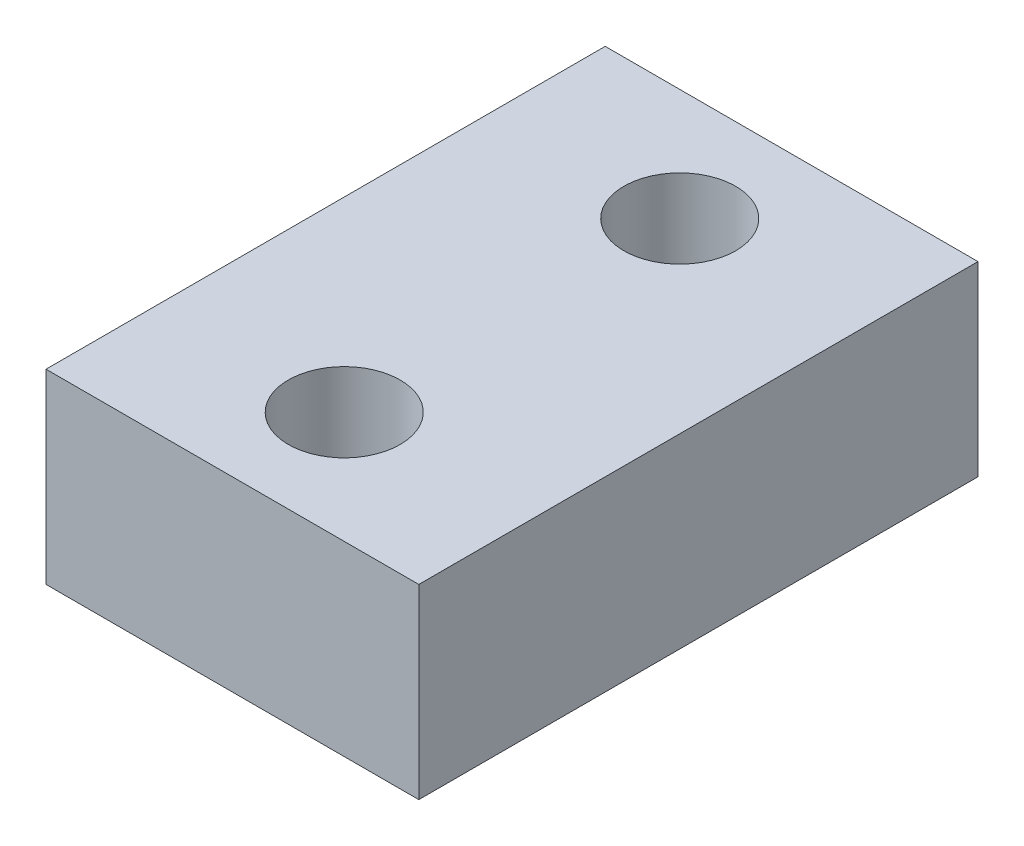
ISO-10303-21;
HEADER;
FILE_DESCRIPTION(('STEP AP214'),'2;1');
FILE_NAME('part.step','',(''),(''),'','','');
FILE_SCHEMA(('AUTOMOTIVE_DESIGN { 1 0 10303 214 1 1 1 1 }'));
ENDSEC;
DATA;
#1=APPLICATION_CONTEXT('core data for automotive mechanical design processes');
#2=APPLICATION_PROTOCOL_DEFINITION('international standard','automotive_design',2000,#1);
#3=PRODUCT_CONTEXT('',#1,'mechanical');
#4=PRODUCT('Part','Part','',(#3));
#5=PRODUCT_RELATED_PRODUCT_CATEGORY('part','',(#4));
#6=PRODUCT_DEFINITION_FORMATION('','',#4);
#7=PRODUCT_DEFINITION_CONTEXT('part definition',#1,'design');
#8=PRODUCT_DEFINITION('design','',#6,#7);
#9=PRODUCT_DEFINITION_SHAPE('','',#8);
#10=(LENGTH_UNIT() NAMED_UNIT(*) SI_UNIT(.MILLI.,.METRE.));
#11=(NAMED_UNIT(*) PLANE_ANGLE_UNIT() SI_UNIT($,.RADIAN.));
#12=(NAMED_UNIT(*) SI_UNIT($,.STERADIAN.) SOLID_ANGLE_UNIT());
#13=UNCERTAINTY_MEASURE_WITH_UNIT(LENGTH_MEASURE(1.E-05),#10,'distance_accuracy_value','');
#14=(GEOMETRIC_REPRESENTATION_CONTEXT(3) GLOBAL_UNCERTAINTY_ASSIGNED_CONTEXT((#13)) GLOBAL_UNIT_ASSIGNED_CONTEXT((#10,
#11,#12)) REPRESENTATION_CONTEXT('',''));
#15=CARTESIAN_POINT('',(0.,0.,0.));
#16=DIRECTION('',(0.,0.,1.));
#17=DIRECTION('',(1.,0.,0.));
#18=AXIS2_PLACEMENT_3D('',#15,#16,#17);
#19=CARTESIAN_POINT('',(0.,5.,15.));
#20=DIRECTION('',(-1.,0.,0.));
#21=DIRECTION('',(0.,-1.,0.));
#22=AXIS2_PLACEMENT_3D('',#19,#20,#21);
#23=PLANE('',#22);
#24=DIRECTION('',(0.,1.,0.));
#25=VECTOR('',#24,1.);
#26=CARTESIAN_POINT('',(0.,5.,0.));
#27=LINE('',#26,#25);
#28=CARTESIAN_POINT('',(0.,0.,0.));
#29=VERTEX_POINT('',#28);
#30=CARTESIAN_POINT('',(0.,5.,0.));
#31=VERTEX_POINT('',#30);
#32=EDGE_CURVE('E96',#29,#31,#27,.T.);
#33=ORIENTED_EDGE('',*,*,#32,.T.);
#34=DIRECTION('',(0.,0.,-1.));
#35=VECTOR('',#34,1.);
#36=CARTESIAN_POINT('',(0.,5.,15.));
#37=LINE('',#36,#35);
#38=CARTESIAN_POINT('',(0.,5.,15.));
#39=VERTEX_POINT('',#38);
#40=EDGE_CURVE('E11',#39,#31,#37,.T.);
#41=ORIENTED_EDGE('',*,*,#40,.F.);
#42=DIRECTION('',(0.,1.,0.));
#43=VECTOR('',#42,1.);
#44=CARTESIAN_POINT('',(0.,5.,15.));
#45=LINE('',#44,#43);
#46=CARTESIAN_POINT('',(0.,0.,15.));
#47=VERTEX_POINT('',#46);
#48=EDGE_CURVE('E84',#47,#39,#45,.T.);
#49=ORIENTED_EDGE('',*,*,#48,.F.);
#50=DIRECTION('',(0.,0.,-1.));
#51=VECTOR('',#50,1.);
#52=CARTESIAN_POINT('',(0.,0.,15.));
#53=LINE('',#52,#51);
#54=EDGE_CURVE('E92',#47,#29,#53,.T.);
#55=ORIENTED_EDGE('',*,*,#54,.T.);
#56=EDGE_LOOP('',(#33,#41,#49,#55));
#57=FACE_BOUND('',#56,.T.);
#58=ADVANCED_FACE('F33',(#57),#23,.F.);
#59=CARTESIAN_POINT('',(-10.,5.,15.));
#60=DIRECTION('',(0.,-1.,0.));
#61=DIRECTION('',(0.,0.,-1.));
#62=AXIS2_PLACEMENT_3D('',#59,#60,#61);
#63=PLANE('',#62);
#64=CARTESIAN_POINT('',(-5.,5.,3.));
#65=DIRECTION('',(0.,-1.,0.));
#66=DIRECTION('',(1.,0.,0.));
#67=AXIS2_PLACEMENT_3D('',#64,#65,#66);
#68=CIRCLE('',#67,1.5);
#69=CARTESIAN_POINT('',(-3.5,5.,3.));
#70=VERTEX_POINT('',#69);
#71=EDGE_CURVE('E113',#70,#70,#68,.T.);
#72=ORIENTED_EDGE('',*,*,#71,.T.);
#73=EDGE_LOOP('',(#72));
#74=FACE_BOUND('',#73,.T.);
#75=CARTESIAN_POINT('',(-5.,5.,12.));
#76=DIRECTION('',(0.,-1.,0.));
#77=DIRECTION('',(1.,0.,0.));
#78=AXIS2_PLACEMENT_3D('',#75,#76,#77);
#79=CIRCLE('',#78,1.5);
#80=CARTESIAN_POINT('',(-3.5,5.,12.));
#81=VERTEX_POINT('',#80);
#82=EDGE_CURVE('E99',#81,#81,#79,.T.);
#83=ORIENTED_EDGE('',*,*,#82,.T.);
#84=EDGE_LOOP('',(#83));
#85=FACE_BOUND('',#84,.T.);
#86=DIRECTION('',(-1.,0.,0.));
#87=VECTOR('',#86,1.);
#88=CARTESIAN_POINT('',(-10.,5.,0.));
#89=LINE('',#88,#87);
#90=CARTESIAN_POINT('',(-10.,5.,0.));
#91=VERTEX_POINT('',#90);
#92=EDGE_CURVE('E88',#31,#91,#89,.T.);
#93=ORIENTED_EDGE('',*,*,#92,.T.);
#94=DIRECTION('',(0.,0.,-1.));
#95=VECTOR('',#94,1.);
#96=CARTESIAN_POINT('',(-10.,5.,15.));
#97=LINE('',#96,#95);
#98=CARTESIAN_POINT('',(-10.,5.,15.));
#99=VERTEX_POINT('',#98);
#100=EDGE_CURVE('E41',#99,#91,#97,.T.);
#101=ORIENTED_EDGE('',*,*,#100,.F.);
#102=DIRECTION('',(-1.,0.,0.));
#103=VECTOR('',#102,1.);
#104=CARTESIAN_POINT('',(-10.,5.,15.));
#105=LINE('',#104,#103);
#106=EDGE_CURVE('E79',#39,#99,#105,.T.);
#107=ORIENTED_EDGE('',*,*,#106,.F.);
#108=ORIENTED_EDGE('',*,*,#40,.T.);
#109=EDGE_LOOP('',(#93,#101,#107,#108));
#110=FACE_BOUND('',#109,.T.);
#111=ADVANCED_FACE('F87',(#74,#85,#110),#63,.F.);
#112=CARTESIAN_POINT('',(-10.,0.,15.));
#113=DIRECTION('',(1.,0.,0.));
#114=DIRECTION('',(0.,0.,-1.));
#115=AXIS2_PLACEMENT_3D('',#112,#113,#114);
#116=PLANE('',#115);
#117=DIRECTION('',(0.,-1.,0.));
#118=VECTOR('',#117,1.);
#119=CARTESIAN_POINT('',(-10.,0.,0.));
#120=LINE('',#119,#118);
#121=CARTESIAN_POINT('',(-10.,0.,0.));
#122=VERTEX_POINT('',#121);
#123=EDGE_CURVE('E66',#91,#122,#120,.T.);
#124=ORIENTED_EDGE('',*,*,#123,.T.);
#125=DIRECTION('',(0.,0.,-1.));
#126=VECTOR('',#125,1.);
#127=CARTESIAN_POINT('',(-10.,0.,15.));
#128=LINE('',#127,#126);
#129=CARTESIAN_POINT('',(-10.,0.,15.));
#130=VERTEX_POINT('',#129);
#131=EDGE_CURVE('E89',#130,#122,#128,.T.);
#132=ORIENTED_EDGE('',*,*,#131,.F.);
#133=DIRECTION('',(0.,-1.,0.));
#134=VECTOR('',#133,1.);
#135=CARTESIAN_POINT('',(-10.,0.,15.));
#136=LINE('',#135,#134);
#137=EDGE_CURVE('E82',#99,#130,#136,.T.);
#138=ORIENTED_EDGE('',*,*,#137,.F.);
#139=ORIENTED_EDGE('',*,*,#100,.T.);
#140=EDGE_LOOP('',(#124,#132,#138,#139));
#141=FACE_BOUND('',#140,.T.);
#142=ADVANCED_FACE('F90',(#141),#116,.F.);
#143=CARTESIAN_POINT('',(0.,0.,15.));
#144=DIRECTION('',(0.,1.,0.));
#145=DIRECTION('',(-1.,0.,0.));
#146=AXIS2_PLACEMENT_3D('',#143,#144,#145);
#147=PLANE('',#146);
#148=CARTESIAN_POINT('',(-5.,0.,3.));
#149=DIRECTION('',(0.,-1.,0.));
#150=DIRECTION('',(1.,0.,0.));
#151=AXIS2_PLACEMENT_3D('',#148,#149,#150);
#152=CIRCLE('',#151,1.5);
#153=CARTESIAN_POINT('',(-3.5,0.,3.));
#154=VERTEX_POINT('',#153);
#155=EDGE_CURVE('E116',#154,#154,#152,.T.);
#156=ORIENTED_EDGE('',*,*,#155,.F.);
#157=EDGE_LOOP('',(#156));
#158=FACE_BOUND('',#157,.T.);
#159=CARTESIAN_POINT('',(-5.,0.,12.));
#160=DIRECTION('',(0.,-1.,0.));
#161=DIRECTION('',(1.,0.,0.));
#162=AXIS2_PLACEMENT_3D('',#159,#160,#161);
#163=CIRCLE('',#162,1.5);
#164=CARTESIAN_POINT('',(-3.5,0.,12.));
#165=VERTEX_POINT('',#164);
#166=EDGE_CURVE('E110',#165,#165,#163,.T.);
#167=ORIENTED_EDGE('',*,*,#166,.F.);
#168=EDGE_LOOP('',(#167));
#169=FACE_BOUND('',#168,.T.);
#170=DIRECTION('',(1.,0.,0.));
#171=VECTOR('',#170,1.);
#172=CARTESIAN_POINT('',(0.,0.,0.));
#173=LINE('',#172,#171);
#174=EDGE_CURVE('E72',#122,#29,#173,.T.);
#175=ORIENTED_EDGE('',*,*,#174,.T.);
#176=ORIENTED_EDGE('',*,*,#54,.F.);
#177=DIRECTION('',(1.,0.,0.));
#178=VECTOR('',#177,1.);
#179=CARTESIAN_POINT('',(0.,0.,15.));
#180=LINE('',#179,#178);
#181=EDGE_CURVE('E49',#130,#47,#180,.T.);
#182=ORIENTED_EDGE('',*,*,#181,.F.);
#183=ORIENTED_EDGE('',*,*,#131,.T.);
#184=EDGE_LOOP('',(#175,#176,#182,#183));
#185=FACE_BOUND('',#184,.T.);
#186=ADVANCED_FACE('F104',(#158,#169,#185),#147,.F.);
#187=CARTESIAN_POINT('',(0.,0.,15.));
#188=DIRECTION('',(0.,0.,-1.));
#189=DIRECTION('',(-1.,0.,0.));
#190=AXIS2_PLACEMENT_3D('',#187,#188,#189);
#191=PLANE('',#190);
#192=ORIENTED_EDGE('',*,*,#48,.T.);
#193=ORIENTED_EDGE('',*,*,#106,.T.);
#194=ORIENTED_EDGE('',*,*,#137,.T.);
#195=ORIENTED_EDGE('',*,*,#181,.T.);
#196=EDGE_LOOP('',(#192,#193,#194,#195));
#197=FACE_BOUND('',#196,.T.);
#198=ADVANCED_FACE('F80',(#197),#191,.F.);
#199=CARTESIAN_POINT('',(0.,0.,0.));
#200=DIRECTION('',(0.,0.,-1.));
#201=DIRECTION('',(-1.,0.,0.));
#202=AXIS2_PLACEMENT_3D('',#199,#200,#201);
#203=PLANE('',#202);
#204=ORIENTED_EDGE('',*,*,#32,.F.);
#205=ORIENTED_EDGE('',*,*,#174,.F.);
#206=ORIENTED_EDGE('',*,*,#123,.F.);
#207=ORIENTED_EDGE('',*,*,#92,.F.);
#208=EDGE_LOOP('',(#204,#205,#206,#207));
#209=FACE_BOUND('',#208,.T.);
#210=ADVANCED_FACE('F107',(#209),#203,.T.);
#211=CARTESIAN_POINT('',(-5.,5.,12.));
#212=DIRECTION('',(0.,-1.,0.));
#213=DIRECTION('',(1.,0.,0.));
#214=AXIS2_PLACEMENT_3D('',#211,#212,#213);
#215=CYLINDRICAL_SURFACE('',#214,1.5);
#216=CARTESIAN_POINT('',(-3.5,5.,12.));
#217=CARTESIAN_POINT('',(-3.5,4.94791666666667,12.));
#218=CARTESIAN_POINT('',(-3.5,4.89583333333334,12.));
#219=CARTESIAN_POINT('',(-3.5,4.79166666666667,12.));
#220=CARTESIAN_POINT('',(-3.5,4.73958333333333,12.));
#221=CARTESIAN_POINT('',(-3.5,4.63541666666667,12.));
#222=CARTESIAN_POINT('',(-3.5,4.58333333333333,12.));
#223=CARTESIAN_POINT('',(-3.5,4.47916666666667,12.));
#224=CARTESIAN_POINT('',(-3.5,4.42708333333333,12.));
#225=CARTESIAN_POINT('',(-3.5,4.32291666666667,12.));
#226=CARTESIAN_POINT('',(-3.5,4.27083333333333,12.));
#227=CARTESIAN_POINT('',(-3.5,4.16666666666667,12.));
#228=CARTESIAN_POINT('',(-3.5,4.11458333333333,12.));
#229=CARTESIAN_POINT('',(-3.5,4.01041666666667,12.));
#230=CARTESIAN_POINT('',(-3.5,3.95833333333333,12.));
#231=CARTESIAN_POINT('',(-3.5,3.85416666666667,12.));
#232=CARTESIAN_POINT('',(-3.5,3.80208333333333,12.));
#233=CARTESIAN_POINT('',(-3.5,3.69791666666667,12.));
#234=CARTESIAN_POINT('',(-3.5,3.64583333333333,12.));
#235=CARTESIAN_POINT('',(-3.5,3.54166666666667,12.));
#236=CARTESIAN_POINT('',(-3.5,3.48958333333333,12.));
#237=CARTESIAN_POINT('',(-3.5,3.38541666666667,12.));
#238=CARTESIAN_POINT('',(-3.5,3.33333333333333,12.));
#239=CARTESIAN_POINT('',(-3.5,3.22916666666667,12.));
#240=CARTESIAN_POINT('',(-3.5,3.17708333333333,12.));
#241=CARTESIAN_POINT('',(-3.5,3.07291666666667,12.));
#242=CARTESIAN_POINT('',(-3.5,3.02083333333333,12.));
#243=CARTESIAN_POINT('',(-3.5,2.91666666666667,12.));
#244=CARTESIAN_POINT('',(-3.5,2.86458333333333,12.));
#245=CARTESIAN_POINT('',(-3.5,2.76041666666667,12.));
#246=CARTESIAN_POINT('',(-3.5,2.70833333333333,12.));
#247=CARTESIAN_POINT('',(-3.5,2.60416666666667,12.));
#248=CARTESIAN_POINT('',(-3.5,2.55208333333333,12.));
#249=CARTESIAN_POINT('',(-3.5,2.44791666666667,12.));
#250=CARTESIAN_POINT('',(-3.5,2.39583333333333,12.));
#251=CARTESIAN_POINT('',(-3.5,2.29166666666667,12.));
#252=CARTESIAN_POINT('',(-3.5,2.23958333333333,12.));
#253=CARTESIAN_POINT('',(-3.5,2.13541666666667,12.));
#254=CARTESIAN_POINT('',(-3.5,2.08333333333333,12.));
#255=CARTESIAN_POINT('',(-3.5,1.97916666666667,12.));
#256=CARTESIAN_POINT('',(-3.5,1.92708333333333,12.));
#257=CARTESIAN_POINT('',(-3.5,1.82291666666667,12.));
#258=CARTESIAN_POINT('',(-3.5,1.77083333333333,12.));
#259=CARTESIAN_POINT('',(-3.5,1.66666666666667,12.));
#260=CARTESIAN_POINT('',(-3.5,1.61458333333333,12.));
#261=CARTESIAN_POINT('',(-3.5,1.51041666666667,12.));
#262=CARTESIAN_POINT('',(-3.5,1.45833333333333,12.));
#263=CARTESIAN_POINT('',(-3.5,1.35416666666667,12.));
#264=CARTESIAN_POINT('',(-3.5,1.30208333333333,12.));
#265=CARTESIAN_POINT('',(-3.5,1.19791666666667,12.));
#266=CARTESIAN_POINT('',(-3.5,1.14583333333333,12.));
#267=CARTESIAN_POINT('',(-3.5,1.04166666666667,12.));
#268=CARTESIAN_POINT('',(-3.5,0.989583333333333,12.));
#269=CARTESIAN_POINT('',(-3.5,0.885416666666667,12.));
#270=CARTESIAN_POINT('',(-3.5,0.833333333333333,12.));
#271=CARTESIAN_POINT('',(-3.5,0.729166666666667,12.));
#272=CARTESIAN_POINT('',(-3.5,0.677083333333333,12.));
#273=CARTESIAN_POINT('',(-3.5,0.572916666666666,12.));
#274=CARTESIAN_POINT('',(-3.5,0.520833333333333,12.));
#275=CARTESIAN_POINT('',(-3.5,0.416666666666666,12.));
#276=CARTESIAN_POINT('',(-3.5,0.364583333333333,12.));
#277=CARTESIAN_POINT('',(-3.5,0.260416666666666,12.));
#278=CARTESIAN_POINT('',(-3.5,0.208333333333333,12.));
#279=CARTESIAN_POINT('',(-3.5,0.104166666666666,12.));
#280=CARTESIAN_POINT('',(-3.5,0.0520833333333326,12.));
#281=CARTESIAN_POINT('',(-3.5,0.,12.));
#282=B_SPLINE_CURVE_WITH_KNOTS('',3,(#216,#217,#218,#219,#220,#221,#222,#223,#224,#225,#226,
#227,#228,#229,#230,#231,#232,#233,#234,#235,#236,#237,#238,#239,#240,#241,#242,#243,#244,#245,
#246,#247,#248,#249,#250,#251,#252,#253,#254,#255,#256,#257,#258,#259,#260,#261,#262,#263,#264,
#265,#266,#267,#268,#269,#270,#271,#272,#273,#274,#275,#276,#277,#278,#279,#280,#281),
.UNSPECIFIED.,.F.,.F.,(4,2,2,2,2,2,2,2,2,2,2,2,2,2,2,2,2,2,2,2,2,2,2,2,2,2,2,2,2,2,2,2,4),(0.,
0.15625,0.3125,0.46875,0.625000000000001,0.781250000000001,0.937500000000001,1.09375,1.25,
1.40625,1.5625,1.71875,1.875,2.03125,2.1875,2.34375,2.5,2.65625,2.8125,2.96875,3.125,3.28125,
3.4375,3.59375,3.75,3.90625,4.0625,4.21875,4.375,4.53125,4.6875,4.84375,5.),.UNSPECIFIED.);
#283=EDGE_CURVE('BSEAM127',#81,#165,#282,.T.);
#284=ORIENTED_EDGE('',*,*,#82,.F.);
#285=ORIENTED_EDGE('',*,*,#166,.T.);
#286=ORIENTED_EDGE('',*,*,#283,.T.);
#287=ORIENTED_EDGE('',*,*,#283,.F.);
#288=EDGE_LOOP('',(#284,#286,#285,#287));
#289=FACE_BOUND('',#288,.T.);
#290=ADVANCED_FACE('F127',(#289),#215,.F.);
#291=CARTESIAN_POINT('',(-5.,5.,3.));
#292=DIRECTION('',(0.,-1.,0.));
#293=DIRECTION('',(1.,0.,0.));
#294=AXIS2_PLACEMENT_3D('',#291,#292,#293);
#295=CYLINDRICAL_SURFACE('',#294,1.5);
#296=CARTESIAN_POINT('',(-3.5,5.,3.));
#297=CARTESIAN_POINT('',(-3.5,4.94791666666667,3.));
#298=CARTESIAN_POINT('',(-3.5,4.89583333333334,3.));
#299=CARTESIAN_POINT('',(-3.5,4.79166666666667,3.));
#300=CARTESIAN_POINT('',(-3.5,4.73958333333333,3.));
#301=CARTESIAN_POINT('',(-3.5,4.63541666666667,3.));
#302=CARTESIAN_POINT('',(-3.5,4.58333333333333,3.));
#303=CARTESIAN_POINT('',(-3.5,4.47916666666667,3.));
#304=CARTESIAN_POINT('',(-3.5,4.42708333333333,3.));
#305=CARTESIAN_POINT('',(-3.5,4.32291666666667,3.));
#306=CARTESIAN_POINT('',(-3.5,4.27083333333333,3.));
#307=CARTESIAN_POINT('',(-3.5,4.16666666666667,3.));
#308=CARTESIAN_POINT('',(-3.5,4.11458333333333,3.));
#309=CARTESIAN_POINT('',(-3.5,4.01041666666667,3.));
#310=CARTESIAN_POINT('',(-3.5,3.95833333333333,3.));
#311=CARTESIAN_POINT('',(-3.5,3.85416666666667,3.));
#312=CARTESIAN_POINT('',(-3.5,3.80208333333333,3.));
#313=CARTESIAN_POINT('',(-3.5,3.69791666666667,3.));
#314=CARTESIAN_POINT('',(-3.5,3.64583333333333,3.));
#315=CARTESIAN_POINT('',(-3.5,3.54166666666667,3.));
#316=CARTESIAN_POINT('',(-3.5,3.48958333333333,3.));
#317=CARTESIAN_POINT('',(-3.5,3.38541666666667,3.));
#318=CARTESIAN_POINT('',(-3.5,3.33333333333333,3.));
#319=CARTESIAN_POINT('',(-3.5,3.22916666666667,3.));
#320=CARTESIAN_POINT('',(-3.5,3.17708333333333,3.));
#321=CARTESIAN_POINT('',(-3.5,3.07291666666667,3.));
#322=CARTESIAN_POINT('',(-3.5,3.02083333333333,3.));
#323=CARTESIAN_POINT('',(-3.5,2.91666666666667,3.));
#324=CARTESIAN_POINT('',(-3.5,2.86458333333333,3.));
#325=CARTESIAN_POINT('',(-3.5,2.76041666666667,3.));
#326=CARTESIAN_POINT('',(-3.5,2.70833333333333,3.));
#327=CARTESIAN_POINT('',(-3.5,2.60416666666667,3.));
#328=CARTESIAN_POINT('',(-3.5,2.55208333333333,3.));
#329=CARTESIAN_POINT('',(-3.5,2.44791666666667,3.));
#330=CARTESIAN_POINT('',(-3.5,2.39583333333333,3.));
#331=CARTESIAN_POINT('',(-3.5,2.29166666666667,3.));
#332=CARTESIAN_POINT('',(-3.5,2.23958333333333,3.));
#333=CARTESIAN_POINT('',(-3.5,2.13541666666667,3.));
#334=CARTESIAN_POINT('',(-3.5,2.08333333333333,3.));
#335=CARTESIAN_POINT('',(-3.5,1.97916666666667,3.));
#336=CARTESIAN_POINT('',(-3.5,1.92708333333333,3.));
#337=CARTESIAN_POINT('',(-3.5,1.82291666666667,3.));
#338=CARTESIAN_POINT('',(-3.5,1.77083333333333,3.));
#339=CARTESIAN_POINT('',(-3.5,1.66666666666667,3.));
#340=CARTESIAN_POINT('',(-3.5,1.61458333333333,3.));
#341=CARTESIAN_POINT('',(-3.5,1.51041666666667,3.));
#342=CARTESIAN_POINT('',(-3.5,1.45833333333333,3.));
#343=CARTESIAN_POINT('',(-3.5,1.35416666666667,3.));
#344=CARTESIAN_POINT('',(-3.5,1.30208333333333,3.));
#345=CARTESIAN_POINT('',(-3.5,1.19791666666667,3.));
#346=CARTESIAN_POINT('',(-3.5,1.14583333333333,3.));
#347=CARTESIAN_POINT('',(-3.5,1.04166666666667,3.));
#348=CARTESIAN_POINT('',(-3.5,0.989583333333333,3.));
#349=CARTESIAN_POINT('',(-3.5,0.885416666666667,3.));
#350=CARTESIAN_POINT('',(-3.5,0.833333333333333,3.));
#351=CARTESIAN_POINT('',(-3.5,0.729166666666667,3.));
#352=CARTESIAN_POINT('',(-3.5,0.677083333333333,3.));
#353=CARTESIAN_POINT('',(-3.5,0.572916666666666,3.));
#354=CARTESIAN_POINT('',(-3.5,0.520833333333333,3.));
#355=CARTESIAN_POINT('',(-3.5,0.416666666666666,3.));
#356=CARTESIAN_POINT('',(-3.5,0.364583333333333,3.));
#357=CARTESIAN_POINT('',(-3.5,0.260416666666666,3.));
#358=CARTESIAN_POINT('',(-3.5,0.208333333333333,3.));
#359=CARTESIAN_POINT('',(-3.5,0.104166666666666,3.));
#360=CARTESIAN_POINT('',(-3.5,0.0520833333333326,3.));
#361=CARTESIAN_POINT('',(-3.5,0.,3.));
#362=B_SPLINE_CURVE_WITH_KNOTS('',3,(#296,#297,#298,#299,#300,#301,#302,#303,#304,#305,#306,
#307,#308,#309,#310,#311,#312,#313,#314,#315,#316,#317,#318,#319,#320,#321,#322,#323,#324,#325,
#326,#327,#328,#329,#330,#331,#332,#333,#334,#335,#336,#337,#338,#339,#340,#341,#342,#343,#344,
#345,#346,#347,#348,#349,#350,#351,#352,#353,#354,#355,#356,#357,#358,#359,#360,#361),
.UNSPECIFIED.,.F.,.F.,(4,2,2,2,2,2,2,2,2,2,2,2,2,2,2,2,2,2,2,2,2,2,2,2,2,2,2,2,2,2,2,2,4),(0.,
0.15625,0.3125,0.46875,0.625000000000001,0.781250000000001,0.937500000000001,1.09375,1.25,
1.40625,1.5625,1.71875,1.875,2.03125,2.1875,2.34375,2.5,2.65625,2.8125,2.96875,3.125,3.28125,
3.4375,3.59375,3.75,3.90625,4.0625,4.21875,4.375,4.53125,4.6875,4.84375,5.),.UNSPECIFIED.);
#363=EDGE_CURVE('BSEAM124',#70,#154,#362,.T.);
#364=ORIENTED_EDGE('',*,*,#71,.F.);
#365=ORIENTED_EDGE('',*,*,#155,.T.);
#366=ORIENTED_EDGE('',*,*,#363,.T.);
#367=ORIENTED_EDGE('',*,*,#363,.F.);
#368=EDGE_LOOP('',(#364,#366,#365,#367));
#369=FACE_BOUND('',#368,.T.);
#370=ADVANCED_FACE('F124',(#369),#295,.F.);
#371=CLOSED_SHELL('',(#58,#111,#142,#186,#198,#210,#290,#370));
#372=MANIFOLD_SOLID_BREP('B2',#371);
#373=ADVANCED_BREP_SHAPE_REPRESENTATION('',(#18,#372),#14);
#374=SHAPE_DEFINITION_REPRESENTATION(#9,#373);
ENDSEC;
END-ISO-10303-21;
